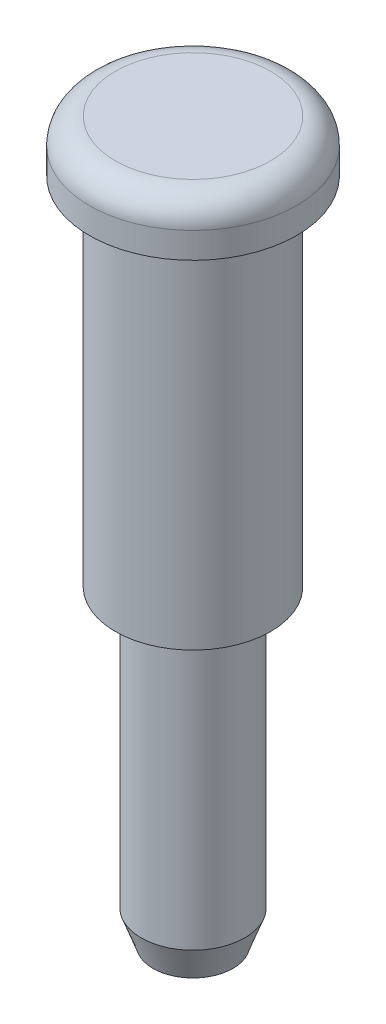
ISO-10303-21;
HEADER;
FILE_DESCRIPTION(('STEP AP214'),'2;1');
FILE_NAME('part.step','',(''),(''),'','','');
FILE_SCHEMA(('AUTOMOTIVE_DESIGN { 1 0 10303 214 1 1 1 1 }'));
ENDSEC;
DATA;
#1=APPLICATION_CONTEXT('core data for automotive mechanical design processes');
#2=APPLICATION_PROTOCOL_DEFINITION('international standard','automotive_design',2000,#1);
#3=PRODUCT_CONTEXT('',#1,'mechanical');
#4=PRODUCT('Part','Part','',(#3));
#5=PRODUCT_RELATED_PRODUCT_CATEGORY('part','',(#4));
#6=PRODUCT_DEFINITION_FORMATION('','',#4);
#7=PRODUCT_DEFINITION_CONTEXT('part definition',#1,'design');
#8=PRODUCT_DEFINITION('design','',#6,#7);
#9=PRODUCT_DEFINITION_SHAPE('','',#8);
#10=(LENGTH_UNIT() NAMED_UNIT(*) SI_UNIT(.MILLI.,.METRE.));
#11=(NAMED_UNIT(*) PLANE_ANGLE_UNIT() SI_UNIT($,.RADIAN.));
#12=(NAMED_UNIT(*) SI_UNIT($,.STERADIAN.) SOLID_ANGLE_UNIT());
#13=UNCERTAINTY_MEASURE_WITH_UNIT(LENGTH_MEASURE(1.E-05),#10,'distance_accuracy_value','');
#14=(GEOMETRIC_REPRESENTATION_CONTEXT(3) GLOBAL_UNCERTAINTY_ASSIGNED_CONTEXT((#13)) GLOBAL_UNIT_ASSIGNED_CONTEXT((#10,
#11,#12)) REPRESENTATION_CONTEXT('',''));
#15=CARTESIAN_POINT('',(0.,0.,0.));
#16=DIRECTION('',(0.,0.,1.));
#17=DIRECTION('',(1.,0.,0.));
#18=AXIS2_PLACEMENT_3D('',#15,#16,#17);
#19=CARTESIAN_POINT('',(0.,31.5,0.));
#20=DIRECTION('',(0.,1.,0.));
#21=DIRECTION('',(-1.,0.,0.));
#22=AXIS2_PLACEMENT_3D('',#19,#20,#21);
#23=PLANE('',#22);
#24=CARTESIAN_POINT('',(0.,31.5,0.));
#25=DIRECTION('',(0.,1.,0.));
#26=DIRECTION('',(-1.,0.,0.));
#27=AXIS2_PLACEMENT_3D('',#24,#25,#26);
#28=CIRCLE('',#27,6.);
#29=CARTESIAN_POINT('',(-5.99999999999998,31.5,0.));
#30=VERTEX_POINT('',#29);
#31=EDGE_CURVE('E10',#30,#30,#28,.T.);
#32=ORIENTED_EDGE('',*,*,#31,.T.);
#33=EDGE_LOOP('',(#32));
#34=FACE_BOUND('',#33,.T.);
#35=ADVANCED_FACE('F31',(#34),#23,.T.);
#36=CARTESIAN_POINT('',(0.,-53.1979512735327,0.));
#37=DIRECTION('',(0.,-1.,0.));
#38=DIRECTION('',(1.,0.,0.));
#39=AXIS2_PLACEMENT_3D('',#36,#37,#38);
#40=CYLINDRICAL_SURFACE('',#39,8.);
#41=CARTESIAN_POINT('',(0.,29.5,0.));
#42=DIRECTION('',(0.,1.,0.));
#43=DIRECTION('',(-1.,0.,0.));
#44=AXIS2_PLACEMENT_3D('',#41,#42,#43);
#45=CIRCLE('',#44,8.);
#46=CARTESIAN_POINT('',(-7.99999999999998,29.5,0.));
#47=VERTEX_POINT('',#46);
#48=EDGE_CURVE('E38',#47,#47,#45,.F.);
#49=ORIENTED_EDGE('',*,*,#48,.T.);
#50=EDGE_LOOP('',(#49));
#51=FACE_BOUND('',#50,.T.);
#52=CARTESIAN_POINT('',(0.,27.5,0.));
#53=DIRECTION('',(0.,-1.,0.));
#54=DIRECTION('',(1.,0.,0.));
#55=AXIS2_PLACEMENT_3D('',#52,#53,#54);
#56=CIRCLE('',#55,7.99999999999999);
#57=CARTESIAN_POINT('',(8.00000000000001,27.5,0.));
#58=VERTEX_POINT('',#57);
#59=EDGE_CURVE('E42',#58,#58,#56,.T.);
#60=ORIENTED_EDGE('',*,*,#59,.F.);
#61=EDGE_LOOP('',(#60));
#62=FACE_BOUND('',#61,.T.);
#63=ADVANCED_FACE('F80',(#51,#62),#40,.T.);
#64=CARTESIAN_POINT('',(8.00000000000001,27.5,0.));
#65=DIRECTION('',(0.,-1.,0.));
#66=DIRECTION('',(1.,0.,0.));
#67=AXIS2_PLACEMENT_3D('',#64,#65,#66);
#68=PLANE('',#67);
#69=ORIENTED_EDGE('',*,*,#59,.T.);
#70=EDGE_LOOP('',(#69));
#71=FACE_BOUND('',#70,.T.);
#72=CARTESIAN_POINT('',(0.,27.5,0.));
#73=DIRECTION('',(0.,-1.,0.));
#74=DIRECTION('',(1.,0.,0.));
#75=AXIS2_PLACEMENT_3D('',#72,#73,#74);
#76=CIRCLE('',#75,5.99999999999999);
#77=CARTESIAN_POINT('',(6.00000000000001,27.5,0.));
#78=VERTEX_POINT('',#77);
#79=EDGE_CURVE('E46',#78,#78,#76,.T.);
#80=ORIENTED_EDGE('',*,*,#79,.F.);
#81=EDGE_LOOP('',(#80));
#82=FACE_BOUND('',#81,.T.);
#83=ADVANCED_FACE('F84',(#71,#82),#68,.T.);
#84=CARTESIAN_POINT('',(0.,-53.1979512735327,0.));
#85=DIRECTION('',(0.,-1.,0.));
#86=DIRECTION('',(1.,0.,0.));
#87=AXIS2_PLACEMENT_3D('',#84,#85,#86);
#88=CYLINDRICAL_SURFACE('',#87,6.);
#89=ORIENTED_EDGE('',*,*,#79,.T.);
#90=EDGE_LOOP('',(#89));
#91=FACE_BOUND('',#90,.T.);
#92=CARTESIAN_POINT('',(0.,0.,0.));
#93=DIRECTION('',(0.,-1.,0.));
#94=DIRECTION('',(1.,0.,0.));
#95=AXIS2_PLACEMENT_3D('',#92,#93,#94);
#96=CIRCLE('',#95,6.);
#97=CARTESIAN_POINT('',(6.00000000000001,0.,0.));
#98=VERTEX_POINT('',#97);
#99=EDGE_CURVE('E51',#98,#98,#96,.T.);
#100=ORIENTED_EDGE('',*,*,#99,.F.);
#101=EDGE_LOOP('',(#100));
#102=FACE_BOUND('',#101,.T.);
#103=ADVANCED_FACE('F89',(#91,#102),#88,.T.);
#104=CARTESIAN_POINT('',(6.00000000000001,0.,0.));
#105=DIRECTION('',(0.,-1.,0.));
#106=DIRECTION('',(1.,0.,0.));
#107=AXIS2_PLACEMENT_3D('',#104,#105,#106);
#108=PLANE('',#107);
#109=ORIENTED_EDGE('',*,*,#99,.T.);
#110=EDGE_LOOP('',(#109));
#111=FACE_BOUND('',#110,.T.);
#112=CARTESIAN_POINT('',(0.,0.,0.));
#113=DIRECTION('',(0.,-1.,0.));
#114=DIRECTION('',(1.,0.,0.));
#115=AXIS2_PLACEMENT_3D('',#112,#113,#114);
#116=CIRCLE('',#115,3.99999999999999);
#117=CARTESIAN_POINT('',(4.,0.,0.));
#118=VERTEX_POINT('',#117);
#119=EDGE_CURVE('E54',#118,#118,#116,.T.);
#120=ORIENTED_EDGE('',*,*,#119,.F.);
#121=EDGE_LOOP('',(#120));
#122=FACE_BOUND('',#121,.T.);
#123=ADVANCED_FACE('F76',(#111,#122),#108,.T.);
#124=CARTESIAN_POINT('',(0.,-53.1979512735327,0.));
#125=DIRECTION('',(0.,-1.,0.));
#126=DIRECTION('',(1.,0.,0.));
#127=AXIS2_PLACEMENT_3D('',#124,#125,#126);
#128=CYLINDRICAL_SURFACE('',#127,3.99999999999999);
#129=ORIENTED_EDGE('',*,*,#119,.T.);
#130=EDGE_LOOP('',(#129));
#131=FACE_BOUND('',#130,.T.);
#132=CARTESIAN_POINT('',(0.,-21.5,0.));
#133=DIRECTION('',(0.,-1.,0.));
#134=DIRECTION('',(1.,0.,0.));
#135=AXIS2_PLACEMENT_3D('',#132,#133,#134);
#136=CIRCLE('',#135,4.);
#137=CARTESIAN_POINT('',(4.,-21.5,0.));
#138=VERTEX_POINT('',#137);
#139=EDGE_CURVE('E57',#138,#138,#136,.T.);
#140=ORIENTED_EDGE('',*,*,#139,.F.);
#141=EDGE_LOOP('',(#140));
#142=FACE_BOUND('',#141,.T.);
#143=ADVANCED_FACE('F68',(#131,#142),#128,.T.);
#144=CARTESIAN_POINT('',(0.,-24.,0.));
#145=DIRECTION('',(0.,1.,0.));
#146=DIRECTION('',(-1.,0.,0.));
#147=AXIS2_PLACEMENT_3D('',#144,#145,#146);
#148=CONICAL_SURFACE('',#147,3.09007441433451,0.34906585039886);
#149=ORIENTED_EDGE('',*,*,#139,.T.);
#150=EDGE_LOOP('',(#149));
#151=FACE_BOUND('',#150,.T.);
#152=CARTESIAN_POINT('',(0.,-24.,0.));
#153=DIRECTION('',(0.,-1.,0.));
#154=DIRECTION('',(1.,0.,0.));
#155=AXIS2_PLACEMENT_3D('',#152,#153,#154);
#156=CIRCLE('',#155,3.09007441433451);
#157=CARTESIAN_POINT('',(3.09007441433452,-24.,0.));
#158=VERTEX_POINT('',#157);
#159=EDGE_CURVE('E60',#158,#158,#156,.T.);
#160=ORIENTED_EDGE('',*,*,#159,.F.);
#161=EDGE_LOOP('',(#160));
#162=FACE_BOUND('',#161,.T.);
#163=ADVANCED_FACE('F66',(#151,#162),#148,.T.);
#164=CARTESIAN_POINT('',(3.09007441433452,-24.,0.));
#165=DIRECTION('',(0.,-1.,0.));
#166=DIRECTION('',(1.,0.,0.));
#167=AXIS2_PLACEMENT_3D('',#164,#165,#166);
#168=PLANE('',#167);
#169=ORIENTED_EDGE('',*,*,#159,.T.);
#170=EDGE_LOOP('',(#169));
#171=FACE_BOUND('',#170,.T.);
#172=ADVANCED_FACE('F64',(#171),#168,.T.);
#173=CARTESIAN_POINT('',(0.,29.5,0.));
#174=DIRECTION('',(0.,1.,0.));
#175=DIRECTION('',(-1.,0.,0.));
#176=AXIS2_PLACEMENT_3D('',#173,#174,#175);
#177=TOROIDAL_SURFACE('',#176,6.,2.);
#178=ORIENTED_EDGE('',*,*,#31,.F.);
#179=EDGE_LOOP('',(#178));
#180=FACE_BOUND('',#179,.T.);
#181=ORIENTED_EDGE('',*,*,#48,.F.);
#182=EDGE_LOOP('',(#181));
#183=FACE_BOUND('',#182,.T.);
#184=ADVANCED_FACE('F33',(#180,#183),#177,.T.);
#185=CLOSED_SHELL('',(#35,#63,#83,#103,#123,#143,#163,#172,#184));
#186=MANIFOLD_SOLID_BREP('B2',#185);
#187=ADVANCED_BREP_SHAPE_REPRESENTATION('',(#18,#186),#14);
#188=SHAPE_DEFINITION_REPRESENTATION(#9,#187);
ENDSEC;
END-ISO-10303-21;
